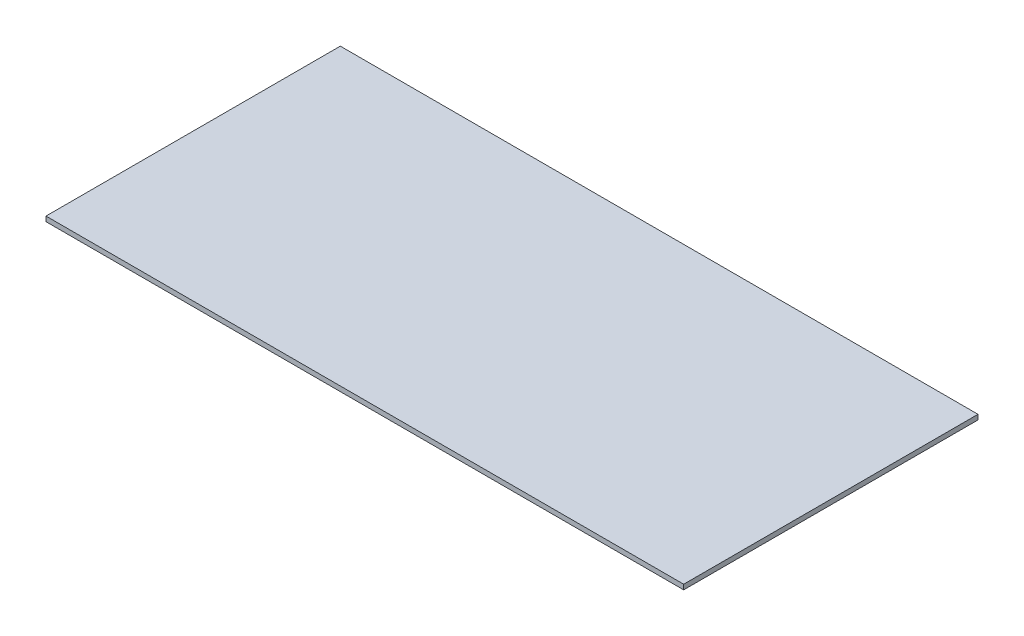
ISO-10303-21;
HEADER;
FILE_DESCRIPTION(('STEP AP214'),'2;1');
FILE_NAME('part.step','',(''),(''),'','','');
FILE_SCHEMA(('AUTOMOTIVE_DESIGN { 1 0 10303 214 1 1 1 1 }'));
ENDSEC;
DATA;
#1=APPLICATION_CONTEXT('core data for automotive mechanical design processes');
#2=APPLICATION_PROTOCOL_DEFINITION('international standard','automotive_design',2000,#1);
#3=PRODUCT_CONTEXT('',#1,'mechanical');
#4=PRODUCT('Part','Part','',(#3));
#5=PRODUCT_RELATED_PRODUCT_CATEGORY('part','',(#4));
#6=PRODUCT_DEFINITION_FORMATION('','',#4);
#7=PRODUCT_DEFINITION_CONTEXT('part definition',#1,'design');
#8=PRODUCT_DEFINITION('design','',#6,#7);
#9=PRODUCT_DEFINITION_SHAPE('','',#8);
#10=(LENGTH_UNIT() NAMED_UNIT(*) SI_UNIT(.MILLI.,.METRE.));
#11=(NAMED_UNIT(*) PLANE_ANGLE_UNIT() SI_UNIT($,.RADIAN.));
#12=(NAMED_UNIT(*) SI_UNIT($,.STERADIAN.) SOLID_ANGLE_UNIT());
#13=UNCERTAINTY_MEASURE_WITH_UNIT(LENGTH_MEASURE(1.E-05),#10,'distance_accuracy_value','');
#14=(GEOMETRIC_REPRESENTATION_CONTEXT(3) GLOBAL_UNCERTAINTY_ASSIGNED_CONTEXT((#13)) GLOBAL_UNIT_ASSIGNED_CONTEXT((#10,
#11,#12)) REPRESENTATION_CONTEXT('',''));
#15=CARTESIAN_POINT('',(0.,0.,0.));
#16=DIRECTION('',(0.,0.,1.));
#17=DIRECTION('',(1.,0.,0.));
#18=AXIS2_PLACEMENT_3D('',#15,#16,#17);
#19=CARTESIAN_POINT('',(0.,0.5,0.));
#20=DIRECTION('',(-1.,0.,0.));
#21=DIRECTION('',(0.,0.,1.));
#22=AXIS2_PLACEMENT_3D('',#19,#20,#21);
#23=PLANE('',#22);
#24=DIRECTION('',(0.,0.,-1.));
#25=VECTOR('',#24,1.);
#26=CARTESIAN_POINT('',(0.,0.,0.));
#27=LINE('',#26,#25);
#28=CARTESIAN_POINT('',(0.,0.,30.));
#29=VERTEX_POINT('',#28);
#30=CARTESIAN_POINT('',(0.,0.,0.));
#31=VERTEX_POINT('',#30);
#32=EDGE_CURVE('E96',#29,#31,#27,.T.);
#33=ORIENTED_EDGE('',*,*,#32,.T.);
#34=DIRECTION('',(0.,-1.,0.));
#35=VECTOR('',#34,1.);
#36=CARTESIAN_POINT('',(0.,0.5,0.));
#37=LINE('',#36,#35);
#38=CARTESIAN_POINT('',(0.,0.5,0.));
#39=VERTEX_POINT('',#38);
#40=EDGE_CURVE('E11',#39,#31,#37,.T.);
#41=ORIENTED_EDGE('',*,*,#40,.F.);
#42=DIRECTION('',(0.,0.,-1.));
#43=VECTOR('',#42,1.);
#44=CARTESIAN_POINT('',(0.,0.5,0.));
#45=LINE('',#44,#43);
#46=CARTESIAN_POINT('',(0.,0.5,30.));
#47=VERTEX_POINT('',#46);
#48=EDGE_CURVE('E84',#47,#39,#45,.T.);
#49=ORIENTED_EDGE('',*,*,#48,.F.);
#50=DIRECTION('',(0.,-1.,0.));
#51=VECTOR('',#50,1.);
#52=CARTESIAN_POINT('',(0.,0.5,30.));
#53=LINE('',#52,#51);
#54=EDGE_CURVE('E92',#47,#29,#53,.T.);
#55=ORIENTED_EDGE('',*,*,#54,.T.);
#56=EDGE_LOOP('',(#33,#41,#49,#55));
#57=FACE_BOUND('',#56,.T.);
#58=ADVANCED_FACE('F33',(#57),#23,.F.);
#59=CARTESIAN_POINT('',(0.,0.5,0.));
#60=DIRECTION('',(0.,0.,1.));
#61=DIRECTION('',(1.,0.,0.));
#62=AXIS2_PLACEMENT_3D('',#59,#60,#61);
#63=PLANE('',#62);
#64=DIRECTION('',(-1.,0.,0.));
#65=VECTOR('',#64,1.);
#66=CARTESIAN_POINT('',(0.,0.,0.));
#67=LINE('',#66,#65);
#68=CARTESIAN_POINT('',(-65.,0.,0.));
#69=VERTEX_POINT('',#68);
#70=EDGE_CURVE('E88',#31,#69,#67,.T.);
#71=ORIENTED_EDGE('',*,*,#70,.T.);
#72=DIRECTION('',(0.,-1.,0.));
#73=VECTOR('',#72,1.);
#74=CARTESIAN_POINT('',(-65.,0.5,0.));
#75=LINE('',#74,#73);
#76=CARTESIAN_POINT('',(-65.,0.5,0.));
#77=VERTEX_POINT('',#76);
#78=EDGE_CURVE('E41',#77,#69,#75,.T.);
#79=ORIENTED_EDGE('',*,*,#78,.F.);
#80=DIRECTION('',(-1.,0.,0.));
#81=VECTOR('',#80,1.);
#82=CARTESIAN_POINT('',(0.,0.5,0.));
#83=LINE('',#82,#81);
#84=EDGE_CURVE('E79',#39,#77,#83,.T.);
#85=ORIENTED_EDGE('',*,*,#84,.F.);
#86=ORIENTED_EDGE('',*,*,#40,.T.);
#87=EDGE_LOOP('',(#71,#79,#85,#86));
#88=FACE_BOUND('',#87,.T.);
#89=ADVANCED_FACE('F87',(#88),#63,.F.);
#90=CARTESIAN_POINT('',(-65.,0.5,0.));
#91=DIRECTION('',(1.,0.,0.));
#92=DIRECTION('',(0.,0.,-1.));
#93=AXIS2_PLACEMENT_3D('',#90,#91,#92);
#94=PLANE('',#93);
#95=DIRECTION('',(0.,0.,1.));
#96=VECTOR('',#95,1.);
#97=CARTESIAN_POINT('',(-65.,0.,0.));
#98=LINE('',#97,#96);
#99=CARTESIAN_POINT('',(-65.,0.,30.));
#100=VERTEX_POINT('',#99);
#101=EDGE_CURVE('E66',#69,#100,#98,.T.);
#102=ORIENTED_EDGE('',*,*,#101,.T.);
#103=DIRECTION('',(0.,-1.,0.));
#104=VECTOR('',#103,1.);
#105=CARTESIAN_POINT('',(-65.,0.5,30.));
#106=LINE('',#105,#104);
#107=CARTESIAN_POINT('',(-65.,0.5,30.));
#108=VERTEX_POINT('',#107);
#109=EDGE_CURVE('E89',#108,#100,#106,.T.);
#110=ORIENTED_EDGE('',*,*,#109,.F.);
#111=DIRECTION('',(0.,0.,1.));
#112=VECTOR('',#111,1.);
#113=CARTESIAN_POINT('',(-65.,0.5,0.));
#114=LINE('',#113,#112);
#115=EDGE_CURVE('E82',#77,#108,#114,.T.);
#116=ORIENTED_EDGE('',*,*,#115,.F.);
#117=ORIENTED_EDGE('',*,*,#78,.T.);
#118=EDGE_LOOP('',(#102,#110,#116,#117));
#119=FACE_BOUND('',#118,.T.);
#120=ADVANCED_FACE('F90',(#119),#94,.F.);
#121=CARTESIAN_POINT('',(0.,0.5,30.));
#122=DIRECTION('',(0.,0.,-1.));
#123=DIRECTION('',(-1.,0.,0.));
#124=AXIS2_PLACEMENT_3D('',#121,#122,#123);
#125=PLANE('',#124);
#126=DIRECTION('',(1.,0.,0.));
#127=VECTOR('',#126,1.);
#128=CARTESIAN_POINT('',(0.,0.,30.));
#129=LINE('',#128,#127);
#130=EDGE_CURVE('E72',#100,#29,#129,.T.);
#131=ORIENTED_EDGE('',*,*,#130,.T.);
#132=ORIENTED_EDGE('',*,*,#54,.F.);
#133=DIRECTION('',(1.,0.,0.));
#134=VECTOR('',#133,1.);
#135=CARTESIAN_POINT('',(0.,0.5,30.));
#136=LINE('',#135,#134);
#137=EDGE_CURVE('E49',#108,#47,#136,.T.);
#138=ORIENTED_EDGE('',*,*,#137,.F.);
#139=ORIENTED_EDGE('',*,*,#109,.T.);
#140=EDGE_LOOP('',(#131,#132,#138,#139));
#141=FACE_BOUND('',#140,.T.);
#142=ADVANCED_FACE('F103',(#141),#125,.F.);
#143=CARTESIAN_POINT('',(0.,0.5,0.));
#144=DIRECTION('',(0.,-1.,0.));
#145=DIRECTION('',(0.,0.,-1.));
#146=AXIS2_PLACEMENT_3D('',#143,#144,#145);
#147=PLANE('',#146);
#148=ORIENTED_EDGE('',*,*,#48,.T.);
#149=ORIENTED_EDGE('',*,*,#84,.T.);
#150=ORIENTED_EDGE('',*,*,#115,.T.);
#151=ORIENTED_EDGE('',*,*,#137,.T.);
#152=EDGE_LOOP('',(#148,#149,#150,#151));
#153=FACE_BOUND('',#152,.T.);
#154=ADVANCED_FACE('F80',(#153),#147,.F.);
#155=CARTESIAN_POINT('',(0.,0.,0.));
#156=DIRECTION('',(0.,-1.,0.));
#157=DIRECTION('',(0.,0.,-1.));
#158=AXIS2_PLACEMENT_3D('',#155,#156,#157);
#159=PLANE('',#158);
#160=ORIENTED_EDGE('',*,*,#32,.F.);
#161=ORIENTED_EDGE('',*,*,#130,.F.);
#162=ORIENTED_EDGE('',*,*,#101,.F.);
#163=ORIENTED_EDGE('',*,*,#70,.F.);
#164=EDGE_LOOP('',(#160,#161,#162,#163));
#165=FACE_BOUND('',#164,.T.);
#166=ADVANCED_FACE('F106',(#165),#159,.T.);
#167=CLOSED_SHELL('',(#58,#89,#120,#142,#154,#166));
#168=MANIFOLD_SOLID_BREP('B2',#167);
#169=ADVANCED_BREP_SHAPE_REPRESENTATION('',(#18,#168),#14);
#170=SHAPE_DEFINITION_REPRESENTATION(#9,#169);
ENDSEC;
END-ISO-10303-21;
